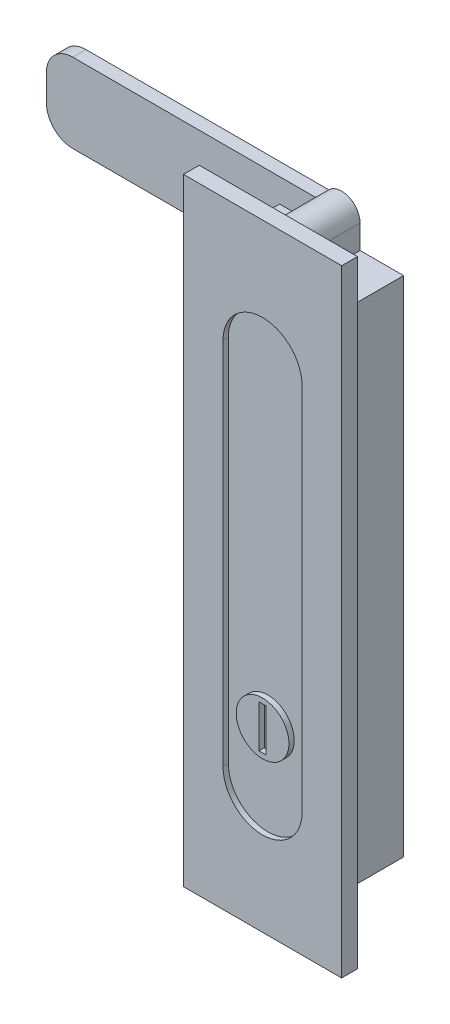
ISO-10303-21;
HEADER;
FILE_DESCRIPTION(('STEP AP214'),'2;1');
FILE_NAME('part.step','',(''),(''),'','','');
FILE_SCHEMA(('AUTOMOTIVE_DESIGN { 1 0 10303 214 1 1 1 1 }'));
ENDSEC;
DATA;
#1=APPLICATION_CONTEXT('core data for automotive mechanical design processes');
#2=APPLICATION_PROTOCOL_DEFINITION('international standard','automotive_design',2000,#1);
#3=PRODUCT_CONTEXT('',#1,'mechanical');
#4=PRODUCT('Part','Part','',(#3));
#5=PRODUCT_RELATED_PRODUCT_CATEGORY('part','',(#4));
#6=PRODUCT_DEFINITION_FORMATION('','',#4);
#7=PRODUCT_DEFINITION_CONTEXT('part definition',#1,'design');
#8=PRODUCT_DEFINITION('design','',#6,#7);
#9=PRODUCT_DEFINITION_SHAPE('','',#8);
#10=(LENGTH_UNIT() NAMED_UNIT(*) SI_UNIT(.MILLI.,.METRE.));
#11=(NAMED_UNIT(*) PLANE_ANGLE_UNIT() SI_UNIT($,.RADIAN.));
#12=(NAMED_UNIT(*) SI_UNIT($,.STERADIAN.) SOLID_ANGLE_UNIT());
#13=UNCERTAINTY_MEASURE_WITH_UNIT(LENGTH_MEASURE(1.E-05),#10,'distance_accuracy_value','');
#14=(GEOMETRIC_REPRESENTATION_CONTEXT(3) GLOBAL_UNCERTAINTY_ASSIGNED_CONTEXT((#13)) GLOBAL_UNIT_ASSIGNED_CONTEXT((#10,
#11,#12)) REPRESENTATION_CONTEXT('',''));
#15=CARTESIAN_POINT('',(0.,0.,0.));
#16=DIRECTION('',(0.,0.,1.));
#17=DIRECTION('',(1.,0.,0.));
#18=AXIS2_PLACEMENT_3D('',#15,#16,#17);
#19=CARTESIAN_POINT('',(15.,-58.5,3.));
#20=DIRECTION('',(-1.,0.,0.));
#21=DIRECTION('',(0.,0.,1.));
#22=AXIS2_PLACEMENT_3D('',#19,#20,#21);
#23=PLANE('',#22);
#24=DIRECTION('',(0.,1.,0.));
#25=VECTOR('',#24,1.);
#26=CARTESIAN_POINT('',(15.,-58.5,0.));
#27=LINE('',#26,#25);
#28=CARTESIAN_POINT('',(15.,-58.5,0.));
#29=VERTEX_POINT('',#28);
#30=CARTESIAN_POINT('',(15.,58.5,0.));
#31=VERTEX_POINT('',#30);
#32=EDGE_CURVE('E484',#29,#31,#27,.T.);
#33=ORIENTED_EDGE('',*,*,#32,.T.);
#34=DIRECTION('',(0.,0.,-1.));
#35=VECTOR('',#34,1.);
#36=CARTESIAN_POINT('',(15.,58.5,3.));
#37=LINE('',#36,#35);
#38=CARTESIAN_POINT('',(15.,58.5,3.));
#39=VERTEX_POINT('',#38);
#40=EDGE_CURVE('E44',#39,#31,#37,.T.);
#41=ORIENTED_EDGE('',*,*,#40,.F.);
#42=DIRECTION('',(0.,1.,0.));
#43=VECTOR('',#42,1.);
#44=CARTESIAN_POINT('',(15.,-58.5,3.));
#45=LINE('',#44,#43);
#46=CARTESIAN_POINT('',(15.,-58.5,3.));
#47=VERTEX_POINT('',#46);
#48=EDGE_CURVE('E494',#47,#39,#45,.T.);
#49=ORIENTED_EDGE('',*,*,#48,.F.);
#50=DIRECTION('',(0.,0.,-1.));
#51=VECTOR('',#50,1.);
#52=CARTESIAN_POINT('',(15.,-58.5,3.));
#53=LINE('',#52,#51);
#54=EDGE_CURVE('E508',#47,#29,#53,.T.);
#55=ORIENTED_EDGE('',*,*,#54,.T.);
#56=EDGE_LOOP('',(#33,#41,#49,#55));
#57=FACE_BOUND('',#56,.T.);
#58=ADVANCED_FACE('F41',(#57),#23,.F.);
#59=CARTESIAN_POINT('',(-15.,58.5,3.));
#60=DIRECTION('',(0.,-1.,0.));
#61=DIRECTION('',(0.,0.,-1.));
#62=AXIS2_PLACEMENT_3D('',#59,#60,#61);
#63=PLANE('',#62);
#64=DIRECTION('',(-1.,0.,0.));
#65=VECTOR('',#64,1.);
#66=CARTESIAN_POINT('',(-15.,58.5,0.));
#67=LINE('',#66,#65);
#68=CARTESIAN_POINT('',(-15.,58.5,0.));
#69=VERTEX_POINT('',#68);
#70=EDGE_CURVE('E512',#31,#69,#67,.T.);
#71=ORIENTED_EDGE('',*,*,#70,.T.);
#72=DIRECTION('',(0.,0.,-1.));
#73=VECTOR('',#72,1.);
#74=CARTESIAN_POINT('',(-15.,58.5,3.));
#75=LINE('',#74,#73);
#76=CARTESIAN_POINT('',(-15.,58.5,3.));
#77=VERTEX_POINT('',#76);
#78=EDGE_CURVE('E526',#77,#69,#75,.T.);
#79=ORIENTED_EDGE('',*,*,#78,.F.);
#80=DIRECTION('',(-1.,0.,0.));
#81=VECTOR('',#80,1.);
#82=CARTESIAN_POINT('',(-15.,58.5,3.));
#83=LINE('',#82,#81);
#84=EDGE_CURVE('E498',#39,#77,#83,.T.);
#85=ORIENTED_EDGE('',*,*,#84,.F.);
#86=ORIENTED_EDGE('',*,*,#40,.T.);
#87=EDGE_LOOP('',(#71,#79,#85,#86));
#88=FACE_BOUND('',#87,.T.);
#89=ADVANCED_FACE('F537',(#88),#63,.F.);
#90=CARTESIAN_POINT('',(-15.,-58.5,3.));
#91=DIRECTION('',(1.,0.,0.));
#92=DIRECTION('',(0.,0.,-1.));
#93=AXIS2_PLACEMENT_3D('',#90,#91,#92);
#94=PLANE('',#93);
#95=DIRECTION('',(0.,-1.,0.));
#96=VECTOR('',#95,1.);
#97=CARTESIAN_POINT('',(-15.,-58.5,0.));
#98=LINE('',#97,#96);
#99=CARTESIAN_POINT('',(-15.,-58.5,0.));
#100=VERTEX_POINT('',#99);
#101=EDGE_CURVE('E515',#69,#100,#98,.T.);
#102=ORIENTED_EDGE('',*,*,#101,.T.);
#103=DIRECTION('',(0.,0.,-1.));
#104=VECTOR('',#103,1.);
#105=CARTESIAN_POINT('',(-15.,-58.5,3.));
#106=LINE('',#105,#104);
#107=CARTESIAN_POINT('',(-15.,-58.5,3.));
#108=VERTEX_POINT('',#107);
#109=EDGE_CURVE('E523',#108,#100,#106,.T.);
#110=ORIENTED_EDGE('',*,*,#109,.F.);
#111=DIRECTION('',(0.,-1.,0.));
#112=VECTOR('',#111,1.);
#113=CARTESIAN_POINT('',(-15.,-58.5,3.));
#114=LINE('',#113,#112);
#115=EDGE_CURVE('E502',#77,#108,#114,.T.);
#116=ORIENTED_EDGE('',*,*,#115,.F.);
#117=ORIENTED_EDGE('',*,*,#78,.T.);
#118=EDGE_LOOP('',(#102,#110,#116,#117));
#119=FACE_BOUND('',#118,.T.);
#120=ADVANCED_FACE('F546',(#119),#94,.F.);
#121=CARTESIAN_POINT('',(-15.,-58.5,3.));
#122=DIRECTION('',(0.,1.,0.));
#123=DIRECTION('',(0.,0.,1.));
#124=AXIS2_PLACEMENT_3D('',#121,#122,#123);
#125=PLANE('',#124);
#126=DIRECTION('',(1.,0.,0.));
#127=VECTOR('',#126,1.);
#128=CARTESIAN_POINT('',(-15.,-58.5,0.));
#129=LINE('',#128,#127);
#130=EDGE_CURVE('E499',#100,#29,#129,.T.);
#131=ORIENTED_EDGE('',*,*,#130,.T.);
#132=ORIENTED_EDGE('',*,*,#54,.F.);
#133=DIRECTION('',(1.,0.,0.));
#134=VECTOR('',#133,1.);
#135=CARTESIAN_POINT('',(-15.,-58.5,3.));
#136=LINE('',#135,#134);
#137=EDGE_CURVE('E505',#108,#47,#136,.T.);
#138=ORIENTED_EDGE('',*,*,#137,.F.);
#139=ORIENTED_EDGE('',*,*,#109,.T.);
#140=EDGE_LOOP('',(#131,#132,#138,#139));
#141=FACE_BOUND('',#140,.T.);
#142=ADVANCED_FACE('F549',(#141),#125,.F.);
#143=CARTESIAN_POINT('',(0.,0.,3.));
#144=DIRECTION('',(0.,0.,-1.));
#145=DIRECTION('',(-1.,0.,0.));
#146=AXIS2_PLACEMENT_3D('',#143,#144,#145);
#147=PLANE('',#146);
#148=DIRECTION('',(0.,1.,0.));
#149=VECTOR('',#148,1.);
#150=CARTESIAN_POINT('',(7.5,-35.,3.));
#151=LINE('',#150,#149);
#152=CARTESIAN_POINT('',(7.5,-35.,3.));
#153=VERTEX_POINT('',#152);
#154=CARTESIAN_POINT('',(7.49999999999999,35.,3.));
#155=VERTEX_POINT('',#154);
#156=EDGE_CURVE('E470',#153,#155,#151,.T.);
#157=ORIENTED_EDGE('',*,*,#156,.F.);
#158=CARTESIAN_POINT('',(0.,-35.,3.));
#159=DIRECTION('',(0.,0.,1.));
#160=DIRECTION('',(1.,0.,0.));
#161=AXIS2_PLACEMENT_3D('',#158,#159,#160);
#162=CIRCLE('',#161,7.5);
#163=CARTESIAN_POINT('',(-7.5,-35.,3.));
#164=VERTEX_POINT('',#163);
#165=EDGE_CURVE('E446',#164,#153,#162,.T.);
#166=ORIENTED_EDGE('',*,*,#165,.F.);
#167=DIRECTION('',(0.,-1.,0.));
#168=VECTOR('',#167,1.);
#169=CARTESIAN_POINT('',(-7.5,-35.,3.));
#170=LINE('',#169,#168);
#171=CARTESIAN_POINT('',(-7.50000000000001,35.,3.));
#172=VERTEX_POINT('',#171);
#173=EDGE_CURVE('E455',#172,#164,#170,.T.);
#174=ORIENTED_EDGE('',*,*,#173,.F.);
#175=CARTESIAN_POINT('',(0.,35.,3.));
#176=DIRECTION('',(0.,0.,1.));
#177=DIRECTION('',(1.,0.,0.));
#178=AXIS2_PLACEMENT_3D('',#175,#176,#177);
#179=CIRCLE('',#178,7.5);
#180=EDGE_CURVE('E474',#155,#172,#179,.T.);
#181=ORIENTED_EDGE('',*,*,#180,.F.);
#182=EDGE_LOOP('',(#157,#166,#174,#181));
#183=FACE_BOUND('',#182,.T.);
#184=ORIENTED_EDGE('',*,*,#48,.T.);
#185=ORIENTED_EDGE('',*,*,#84,.T.);
#186=ORIENTED_EDGE('',*,*,#115,.T.);
#187=ORIENTED_EDGE('',*,*,#137,.T.);
#188=EDGE_LOOP('',(#184,#185,#186,#187));
#189=FACE_BOUND('',#188,.T.);
#190=ADVANCED_FACE('F551',(#183,#189),#147,.F.);
#191=CARTESIAN_POINT('',(0.,0.,0.));
#192=DIRECTION('',(0.,0.,-1.));
#193=DIRECTION('',(-1.,0.,0.));
#194=AXIS2_PLACEMENT_3D('',#191,#192,#193);
#195=PLANE('',#194);
#196=DIRECTION('',(-1.,0.,0.));
#197=VECTOR('',#196,1.);
#198=CARTESIAN_POINT('',(0.,-47.75,0.));
#199=LINE('',#198,#197);
#200=CARTESIAN_POINT('',(11.75,-47.75,0.));
#201=VERTEX_POINT('',#200);
#202=CARTESIAN_POINT('',(3.49999999999999,-47.75,0.));
#203=VERTEX_POINT('',#202);
#204=EDGE_CURVE('E264',#201,#203,#199,.T.);
#205=ORIENTED_EDGE('',*,*,#204,.F.);
#206=DIRECTION('',(0.,1.,0.));
#207=VECTOR('',#206,1.);
#208=CARTESIAN_POINT('',(11.75,0.,0.));
#209=LINE('',#208,#207);
#210=CARTESIAN_POINT('',(11.75,47.75,0.));
#211=VERTEX_POINT('',#210);
#212=EDGE_CURVE('E278',#201,#211,#209,.T.);
#213=ORIENTED_EDGE('',*,*,#212,.T.);
#214=DIRECTION('',(-1.,0.,0.));
#215=VECTOR('',#214,1.);
#216=CARTESIAN_POINT('',(0.,47.75,0.));
#217=LINE('',#216,#215);
#218=CARTESIAN_POINT('',(3.49999999999999,47.75,0.));
#219=VERTEX_POINT('',#218);
#220=EDGE_CURVE('E350',#211,#219,#217,.T.);
#221=ORIENTED_EDGE('',*,*,#220,.T.);
#222=DIRECTION('',(0.,1.,0.));
#223=VECTOR('',#222,1.);
#224=CARTESIAN_POINT('',(3.49999999999999,0.,0.));
#225=LINE('',#224,#223);
#226=CARTESIAN_POINT('',(3.5,52.25,0.));
#227=VERTEX_POINT('',#226);
#228=EDGE_CURVE('E346',#219,#227,#225,.T.);
#229=ORIENTED_EDGE('',*,*,#228,.T.);
#230=CARTESIAN_POINT('',(0.,52.25,0.));
#231=DIRECTION('',(0.,0.,-1.));
#232=DIRECTION('',(-1.,0.,0.));
#233=AXIS2_PLACEMENT_3D('',#230,#231,#232);
#234=CIRCLE('',#233,3.5);
#235=CARTESIAN_POINT('',(-3.49999999999999,52.25,0.));
#236=VERTEX_POINT('',#235);
#237=EDGE_CURVE('E342',#236,#227,#234,.T.);
#238=ORIENTED_EDGE('',*,*,#237,.F.);
#239=DIRECTION('',(0.,1.,0.));
#240=VECTOR('',#239,1.);
#241=CARTESIAN_POINT('',(-3.5,0.,0.));
#242=LINE('',#241,#240);
#243=CARTESIAN_POINT('',(-3.5,47.75,0.));
#244=VERTEX_POINT('',#243);
#245=EDGE_CURVE('E339',#244,#236,#242,.T.);
#246=ORIENTED_EDGE('',*,*,#245,.F.);
#247=DIRECTION('',(-1.,0.,0.));
#248=VECTOR('',#247,1.);
#249=CARTESIAN_POINT('',(0.,47.75,0.));
#250=LINE('',#249,#248);
#251=CARTESIAN_POINT('',(-11.75,47.75,0.));
#252=VERTEX_POINT('',#251);
#253=EDGE_CURVE('E335',#244,#252,#250,.T.);
#254=ORIENTED_EDGE('',*,*,#253,.T.);
#255=DIRECTION('',(0.,1.,0.));
#256=VECTOR('',#255,1.);
#257=CARTESIAN_POINT('',(-11.75,0.,0.));
#258=LINE('',#257,#256);
#259=CARTESIAN_POINT('',(-11.75,-47.75,0.));
#260=VERTEX_POINT('',#259);
#261=EDGE_CURVE('E331',#260,#252,#258,.T.);
#262=ORIENTED_EDGE('',*,*,#261,.F.);
#263=DIRECTION('',(-1.,0.,0.));
#264=VECTOR('',#263,1.);
#265=CARTESIAN_POINT('',(0.,-47.75,0.));
#266=LINE('',#265,#264);
#267=CARTESIAN_POINT('',(-3.5,-47.75,0.));
#268=VERTEX_POINT('',#267);
#269=EDGE_CURVE('E328',#268,#260,#266,.T.);
#270=ORIENTED_EDGE('',*,*,#269,.F.);
#271=DIRECTION('',(0.,1.,0.));
#272=VECTOR('',#271,1.);
#273=CARTESIAN_POINT('',(-3.5,0.,0.));
#274=LINE('',#273,#272);
#275=CARTESIAN_POINT('',(-3.50000000000001,-52.25,0.));
#276=VERTEX_POINT('',#275);
#277=EDGE_CURVE('E325',#276,#268,#274,.T.);
#278=ORIENTED_EDGE('',*,*,#277,.F.);
#279=CARTESIAN_POINT('',(0.,-52.25,0.));
#280=DIRECTION('',(0.,0.,-1.));
#281=DIRECTION('',(-1.,0.,0.));
#282=AXIS2_PLACEMENT_3D('',#279,#280,#281);
#283=CIRCLE('',#282,3.5);
#284=CARTESIAN_POINT('',(3.49999999999999,-52.25,0.));
#285=VERTEX_POINT('',#284);
#286=EDGE_CURVE('E322',#285,#276,#283,.T.);
#287=ORIENTED_EDGE('',*,*,#286,.F.);
#288=DIRECTION('',(0.,1.,0.));
#289=VECTOR('',#288,1.);
#290=CARTESIAN_POINT('',(3.49999999999999,0.,0.));
#291=LINE('',#290,#289);
#292=EDGE_CURVE('E268',#285,#203,#291,.T.);
#293=ORIENTED_EDGE('',*,*,#292,.T.);
#294=EDGE_LOOP('',(#205,#213,#221,#229,#238,#246,#254,#262,#270,#278,#287,#293));
#295=FACE_BOUND('',#294,.T.);
#296=ORIENTED_EDGE('',*,*,#32,.F.);
#297=ORIENTED_EDGE('',*,*,#130,.F.);
#298=ORIENTED_EDGE('',*,*,#101,.F.);
#299=ORIENTED_EDGE('',*,*,#70,.F.);
#300=EDGE_LOOP('',(#296,#297,#298,#299));
#301=FACE_BOUND('',#300,.T.);
#302=ADVANCED_FACE('F544',(#295,#301),#195,.T.);
#303=CARTESIAN_POINT('',(0.,-35.,2.));
#304=DIRECTION('',(0.,0.,1.));
#305=DIRECTION('',(1.,0.,0.));
#306=AXIS2_PLACEMENT_3D('',#303,#304,#305);
#307=CYLINDRICAL_SURFACE('',#306,7.5);
#308=ORIENTED_EDGE('',*,*,#165,.T.);
#309=DIRECTION('',(0.,0.,1.));
#310=VECTOR('',#309,1.);
#311=CARTESIAN_POINT('',(7.5,-35.,2.));
#312=LINE('',#311,#310);
#313=CARTESIAN_POINT('',(7.5,-35.,2.));
#314=VERTEX_POINT('',#313);
#315=EDGE_CURVE('E467',#314,#153,#312,.T.);
#316=ORIENTED_EDGE('',*,*,#315,.F.);
#317=CARTESIAN_POINT('',(0.,-35.,2.));
#318=DIRECTION('',(0.,0.,1.));
#319=DIRECTION('',(1.,0.,0.));
#320=AXIS2_PLACEMENT_3D('',#317,#318,#319);
#321=CIRCLE('',#320,7.5);
#322=CARTESIAN_POINT('',(-7.5,-35.,2.));
#323=VERTEX_POINT('',#322);
#324=EDGE_CURVE('E450',#323,#314,#321,.T.);
#325=ORIENTED_EDGE('',*,*,#324,.F.);
#326=DIRECTION('',(0.,0.,1.));
#327=VECTOR('',#326,1.);
#328=CARTESIAN_POINT('',(-7.5,-35.,2.));
#329=LINE('',#328,#327);
#330=EDGE_CURVE('E481',#323,#164,#329,.T.);
#331=ORIENTED_EDGE('',*,*,#330,.T.);
#332=EDGE_LOOP('',(#308,#316,#325,#331));
#333=FACE_BOUND('',#332,.T.);
#334=ADVANCED_FACE('F560',(#333),#307,.F.);
#335=CARTESIAN_POINT('',(-7.5,-35.,2.));
#336=DIRECTION('',(-1.,0.,0.));
#337=DIRECTION('',(0.,-1.,0.));
#338=AXIS2_PLACEMENT_3D('',#335,#336,#337);
#339=PLANE('',#338);
#340=ORIENTED_EDGE('',*,*,#173,.T.);
#341=ORIENTED_EDGE('',*,*,#330,.F.);
#342=DIRECTION('',(0.,-1.,0.));
#343=VECTOR('',#342,1.);
#344=CARTESIAN_POINT('',(-7.5,-35.,2.));
#345=LINE('',#344,#343);
#346=CARTESIAN_POINT('',(-7.50000000000001,35.,2.));
#347=VERTEX_POINT('',#346);
#348=EDGE_CURVE('E463',#347,#323,#345,.T.);
#349=ORIENTED_EDGE('',*,*,#348,.F.);
#350=DIRECTION('',(0.,0.,1.));
#351=VECTOR('',#350,1.);
#352=CARTESIAN_POINT('',(-7.50000000000001,35.,2.));
#353=LINE('',#352,#351);
#354=EDGE_CURVE('E485',#347,#172,#353,.T.);
#355=ORIENTED_EDGE('',*,*,#354,.T.);
#356=EDGE_LOOP('',(#340,#341,#349,#355));
#357=FACE_BOUND('',#356,.T.);
#358=ADVANCED_FACE('F598',(#357),#339,.F.);
#359=CARTESIAN_POINT('',(0.,35.,2.));
#360=DIRECTION('',(0.,0.,1.));
#361=DIRECTION('',(1.,0.,0.));
#362=AXIS2_PLACEMENT_3D('',#359,#360,#361);
#363=CYLINDRICAL_SURFACE('',#362,7.5);
#364=ORIENTED_EDGE('',*,*,#180,.T.);
#365=ORIENTED_EDGE('',*,*,#354,.F.);
#366=CARTESIAN_POINT('',(0.,35.,2.));
#367=DIRECTION('',(0.,0.,1.));
#368=DIRECTION('',(1.,0.,0.));
#369=AXIS2_PLACEMENT_3D('',#366,#367,#368);
#370=CIRCLE('',#369,7.5);
#371=CARTESIAN_POINT('',(7.49999999999999,35.,2.));
#372=VERTEX_POINT('',#371);
#373=EDGE_CURVE('E459',#372,#347,#370,.T.);
#374=ORIENTED_EDGE('',*,*,#373,.F.);
#375=DIRECTION('',(0.,0.,1.));
#376=VECTOR('',#375,1.);
#377=CARTESIAN_POINT('',(7.49999999999999,35.,2.));
#378=LINE('',#377,#376);
#379=EDGE_CURVE('E488',#372,#155,#378,.T.);
#380=ORIENTED_EDGE('',*,*,#379,.T.);
#381=EDGE_LOOP('',(#364,#365,#374,#380));
#382=FACE_BOUND('',#381,.T.);
#383=ADVANCED_FACE('F608',(#382),#363,.F.);
#384=CARTESIAN_POINT('',(7.5,-35.,2.));
#385=DIRECTION('',(1.,0.,0.));
#386=DIRECTION('',(0.,1.,0.));
#387=AXIS2_PLACEMENT_3D('',#384,#385,#386);
#388=PLANE('',#387);
#389=ORIENTED_EDGE('',*,*,#156,.T.);
#390=ORIENTED_EDGE('',*,*,#379,.F.);
#391=DIRECTION('',(0.,1.,0.));
#392=VECTOR('',#391,1.);
#393=CARTESIAN_POINT('',(7.5,-35.,2.));
#394=LINE('',#393,#392);
#395=EDGE_CURVE('E454',#314,#372,#394,.T.);
#396=ORIENTED_EDGE('',*,*,#395,.F.);
#397=ORIENTED_EDGE('',*,*,#315,.T.);
#398=EDGE_LOOP('',(#389,#390,#396,#397));
#399=FACE_BOUND('',#398,.T.);
#400=ADVANCED_FACE('F618',(#399),#388,.F.);
#401=CARTESIAN_POINT('',(0.,-35.,2.));
#402=DIRECTION('',(0.,0.,1.));
#403=DIRECTION('',(1.,0.,0.));
#404=AXIS2_PLACEMENT_3D('',#401,#402,#403);
#405=PLANE('',#404);
#406=CARTESIAN_POINT('',(0.,-25.,2.));
#407=DIRECTION('',(0.,0.,1.));
#408=DIRECTION('',(1.,0.,0.));
#409=AXIS2_PLACEMENT_3D('',#406,#407,#408);
#410=CIRCLE('',#409,5.);
#411=CARTESIAN_POINT('',(5.,-25.,2.));
#412=VERTEX_POINT('',#411);
#413=EDGE_CURVE('E442',#412,#412,#410,.T.);
#414=ORIENTED_EDGE('',*,*,#413,.F.);
#415=EDGE_LOOP('',(#414));
#416=FACE_BOUND('',#415,.T.);
#417=ORIENTED_EDGE('',*,*,#324,.T.);
#418=ORIENTED_EDGE('',*,*,#395,.T.);
#419=ORIENTED_EDGE('',*,*,#373,.T.);
#420=ORIENTED_EDGE('',*,*,#348,.T.);
#421=EDGE_LOOP('',(#417,#418,#419,#420));
#422=FACE_BOUND('',#421,.T.);
#423=ADVANCED_FACE('F628',(#416,#422),#405,.T.);
#424=CARTESIAN_POINT('',(0.,-25.,2.));
#425=DIRECTION('',(0.,0.,1.));
#426=DIRECTION('',(1.,0.,0.));
#427=AXIS2_PLACEMENT_3D('',#424,#425,#426);
#428=CYLINDRICAL_SURFACE('',#427,5.);
#429=ORIENTED_EDGE('',*,*,#413,.T.);
#430=EDGE_LOOP('',(#429));
#431=FACE_BOUND('',#430,.T.);
#432=CARTESIAN_POINT('',(0.,-25.,3.));
#433=DIRECTION('',(0.,0.,1.));
#434=DIRECTION('',(1.,0.,0.));
#435=AXIS2_PLACEMENT_3D('',#432,#433,#434);
#436=CIRCLE('',#435,5.);
#437=CARTESIAN_POINT('',(5.,-25.,3.));
#438=VERTEX_POINT('',#437);
#439=EDGE_CURVE('E432',#438,#438,#436,.T.);
#440=ORIENTED_EDGE('',*,*,#439,.F.);
#441=EDGE_LOOP('',(#440));
#442=FACE_BOUND('',#441,.T.);
#443=ADVANCED_FACE('F568',(#431,#442),#428,.T.);
#444=DIRECTION('',(-1.,0.,0.));
#445=VECTOR('',#444,1.);
#446=CARTESIAN_POINT('',(-0.675723307919637,-20.9707927175478,3.));
#447=LINE('',#446,#445);
#448=CARTESIAN_POINT('',(0.675723307919637,-20.9707927175478,3.));
#449=VERTEX_POINT('',#448);
#450=CARTESIAN_POINT('',(-0.675723307919637,-20.9707927175478,3.));
#451=VERTEX_POINT('',#450);
#452=EDGE_CURVE('E418',#449,#451,#447,.T.);
#453=ORIENTED_EDGE('',*,*,#452,.F.);
#454=DIRECTION('',(0.,1.,0.));
#455=VECTOR('',#454,1.);
#456=CARTESIAN_POINT('',(0.675723307919637,-29.0292072824523,3.));
#457=LINE('',#456,#455);
#458=CARTESIAN_POINT('',(0.675723307919637,-29.0292072824523,3.));
#459=VERTEX_POINT('',#458);
#460=EDGE_CURVE('E397',#459,#449,#457,.T.);
#461=ORIENTED_EDGE('',*,*,#460,.F.);
#462=DIRECTION('',(1.,0.,0.));
#463=VECTOR('',#462,1.);
#464=CARTESIAN_POINT('',(-0.675723307919637,-29.0292072824523,3.));
#465=LINE('',#464,#463);
#466=CARTESIAN_POINT('',(-0.675723307919637,-29.0292072824523,3.));
#467=VERTEX_POINT('',#466);
#468=EDGE_CURVE('E403',#467,#459,#465,.T.);
#469=ORIENTED_EDGE('',*,*,#468,.F.);
#470=DIRECTION('',(0.,-1.,0.));
#471=VECTOR('',#470,1.);
#472=CARTESIAN_POINT('',(-0.675723307919637,-29.0292072824523,3.));
#473=LINE('',#472,#471);
#474=EDGE_CURVE('E422',#451,#467,#473,.T.);
#475=ORIENTED_EDGE('',*,*,#474,.F.);
#476=EDGE_LOOP('',(#453,#461,#469,#475));
#477=FACE_BOUND('',#476,.T.);
#478=ORIENTED_EDGE('',*,*,#439,.T.);
#479=EDGE_LOOP('',(#478));
#480=FACE_BOUND('',#479,.T.);
#481=ADVANCED_FACE('F555',(#477,#480),#147,.F.);
#482=CARTESIAN_POINT('',(0.675723307919637,-29.0292072824523,2.));
#483=DIRECTION('',(1.,0.,0.));
#484=DIRECTION('',(0.,0.,-1.));
#485=AXIS2_PLACEMENT_3D('',#482,#483,#484);
#486=PLANE('',#485);
#487=ORIENTED_EDGE('',*,*,#460,.T.);
#488=DIRECTION('',(0.,0.,1.));
#489=VECTOR('',#488,1.);
#490=CARTESIAN_POINT('',(0.675723307919637,-20.9707927175478,2.));
#491=LINE('',#490,#489);
#492=CARTESIAN_POINT('',(0.675723307919637,-20.9707927175478,2.));
#493=VERTEX_POINT('',#492);
#494=EDGE_CURVE('E415',#493,#449,#491,.T.);
#495=ORIENTED_EDGE('',*,*,#494,.F.);
#496=DIRECTION('',(0.,1.,0.));
#497=VECTOR('',#496,1.);
#498=CARTESIAN_POINT('',(0.675723307919637,-29.0292072824523,2.));
#499=LINE('',#498,#497);
#500=CARTESIAN_POINT('',(0.675723307919637,-29.0292072824523,2.));
#501=VERTEX_POINT('',#500);
#502=EDGE_CURVE('E398',#501,#493,#499,.T.);
#503=ORIENTED_EDGE('',*,*,#502,.F.);
#504=DIRECTION('',(0.,0.,1.));
#505=VECTOR('',#504,1.);
#506=CARTESIAN_POINT('',(0.675723307919637,-29.0292072824523,2.));
#507=LINE('',#506,#505);
#508=EDGE_CURVE('E429',#501,#459,#507,.T.);
#509=ORIENTED_EDGE('',*,*,#508,.T.);
#510=EDGE_LOOP('',(#487,#495,#503,#509));
#511=FACE_BOUND('',#510,.T.);
#512=ADVANCED_FACE('F567',(#511),#486,.F.);
#513=CARTESIAN_POINT('',(-0.675723307919637,-29.0292072824523,2.));
#514=DIRECTION('',(0.,-1.,0.));
#515=DIRECTION('',(0.,0.,-1.));
#516=AXIS2_PLACEMENT_3D('',#513,#514,#515);
#517=PLANE('',#516);
#518=ORIENTED_EDGE('',*,*,#468,.T.);
#519=ORIENTED_EDGE('',*,*,#508,.F.);
#520=DIRECTION('',(1.,0.,0.));
#521=VECTOR('',#520,1.);
#522=CARTESIAN_POINT('',(-0.675723307919637,-29.0292072824523,2.));
#523=LINE('',#522,#521);
#524=CARTESIAN_POINT('',(-0.675723307919637,-29.0292072824523,2.));
#525=VERTEX_POINT('',#524);
#526=EDGE_CURVE('E411',#525,#501,#523,.T.);
#527=ORIENTED_EDGE('',*,*,#526,.F.);
#528=DIRECTION('',(0.,0.,1.));
#529=VECTOR('',#528,1.);
#530=CARTESIAN_POINT('',(-0.675723307919637,-29.0292072824523,2.));
#531=LINE('',#530,#529);
#532=EDGE_CURVE('E433',#525,#467,#531,.T.);
#533=ORIENTED_EDGE('',*,*,#532,.T.);
#534=EDGE_LOOP('',(#518,#519,#527,#533));
#535=FACE_BOUND('',#534,.T.);
#536=ADVANCED_FACE('F661',(#535),#517,.F.);
#537=CARTESIAN_POINT('',(-0.675723307919637,-29.0292072824523,2.));
#538=DIRECTION('',(-1.,0.,0.));
#539=DIRECTION('',(0.,0.,1.));
#540=AXIS2_PLACEMENT_3D('',#537,#538,#539);
#541=PLANE('',#540);
#542=ORIENTED_EDGE('',*,*,#474,.T.);
#543=ORIENTED_EDGE('',*,*,#532,.F.);
#544=DIRECTION('',(0.,-1.,0.));
#545=VECTOR('',#544,1.);
#546=CARTESIAN_POINT('',(-0.675723307919637,-29.0292072824523,2.));
#547=LINE('',#546,#545);
#548=CARTESIAN_POINT('',(-0.675723307919637,-20.9707927175478,2.));
#549=VERTEX_POINT('',#548);
#550=EDGE_CURVE('E407',#549,#525,#547,.T.);
#551=ORIENTED_EDGE('',*,*,#550,.F.);
#552=DIRECTION('',(0.,0.,1.));
#553=VECTOR('',#552,1.);
#554=CARTESIAN_POINT('',(-0.675723307919637,-20.9707927175478,2.));
#555=LINE('',#554,#553);
#556=EDGE_CURVE('E436',#549,#451,#555,.T.);
#557=ORIENTED_EDGE('',*,*,#556,.T.);
#558=EDGE_LOOP('',(#542,#543,#551,#557));
#559=FACE_BOUND('',#558,.T.);
#560=ADVANCED_FACE('F671',(#559),#541,.F.);
#561=CARTESIAN_POINT('',(-0.675723307919637,-20.9707927175478,2.));
#562=DIRECTION('',(0.,1.,0.));
#563=DIRECTION('',(0.,0.,1.));
#564=AXIS2_PLACEMENT_3D('',#561,#562,#563);
#565=PLANE('',#564);
#566=ORIENTED_EDGE('',*,*,#452,.T.);
#567=ORIENTED_EDGE('',*,*,#556,.F.);
#568=DIRECTION('',(-1.,0.,0.));
#569=VECTOR('',#568,1.);
#570=CARTESIAN_POINT('',(-0.675723307919637,-20.9707927175478,2.));
#571=LINE('',#570,#569);
#572=EDGE_CURVE('E402',#493,#549,#571,.T.);
#573=ORIENTED_EDGE('',*,*,#572,.F.);
#574=ORIENTED_EDGE('',*,*,#494,.T.);
#575=EDGE_LOOP('',(#566,#567,#573,#574));
#576=FACE_BOUND('',#575,.T.);
#577=ADVANCED_FACE('F681',(#576),#565,.F.);
#578=CARTESIAN_POINT('',(0.,0.,2.));
#579=DIRECTION('',(0.,0.,-1.));
#580=DIRECTION('',(-1.,0.,0.));
#581=AXIS2_PLACEMENT_3D('',#578,#579,#580);
#582=PLANE('',#581);
#583=ORIENTED_EDGE('',*,*,#502,.T.);
#584=ORIENTED_EDGE('',*,*,#572,.T.);
#585=ORIENTED_EDGE('',*,*,#550,.T.);
#586=ORIENTED_EDGE('',*,*,#526,.T.);
#587=EDGE_LOOP('',(#583,#584,#585,#586));
#588=FACE_BOUND('',#587,.T.);
#589=ADVANCED_FACE('F691',(#588),#582,.F.);
#590=CARTESIAN_POINT('',(0.,-47.75,-12.));
#591=DIRECTION('',(0.,1.,0.));
#592=DIRECTION('',(0.,0.,1.));
#593=AXIS2_PLACEMENT_3D('',#590,#591,#592);
#594=PLANE('',#593);
#595=ORIENTED_EDGE('',*,*,#204,.T.);
#596=DIRECTION('',(0.,0.,1.));
#597=VECTOR('',#596,1.);
#598=CARTESIAN_POINT('',(3.49999999999999,-47.75,-12.));
#599=LINE('',#598,#597);
#600=CARTESIAN_POINT('',(3.49999999999999,-47.75,-12.));
#601=VERTEX_POINT('',#600);
#602=EDGE_CURVE('E393',#601,#203,#599,.T.);
#603=ORIENTED_EDGE('',*,*,#602,.F.);
#604=DIRECTION('',(-1.,0.,0.));
#605=VECTOR('',#604,1.);
#606=CARTESIAN_POINT('',(0.,-47.75,-12.));
#607=LINE('',#606,#605);
#608=CARTESIAN_POINT('',(11.75,-47.75,-12.));
#609=VERTEX_POINT('',#608);
#610=EDGE_CURVE('E274',#609,#601,#607,.T.);
#611=ORIENTED_EDGE('',*,*,#610,.F.);
#612=DIRECTION('',(0.,0.,1.));
#613=VECTOR('',#612,1.);
#614=CARTESIAN_POINT('',(11.75,-47.75,-12.));
#615=LINE('',#614,#613);
#616=EDGE_CURVE('E317',#609,#201,#615,.T.);
#617=ORIENTED_EDGE('',*,*,#616,.T.);
#618=EDGE_LOOP('',(#595,#603,#611,#617));
#619=FACE_BOUND('',#618,.T.);
#620=ADVANCED_FACE('F701',(#619),#594,.F.);
#621=CARTESIAN_POINT('',(3.49999999999999,0.,-12.));
#622=DIRECTION('',(1.,0.,0.));
#623=DIRECTION('',(0.,1.,0.));
#624=AXIS2_PLACEMENT_3D('',#621,#622,#623);
#625=PLANE('',#624);
#626=ORIENTED_EDGE('',*,*,#292,.F.);
#627=DIRECTION('',(0.,0.,1.));
#628=VECTOR('',#627,1.);
#629=CARTESIAN_POINT('',(3.49999999999999,-52.25,-12.));
#630=LINE('',#629,#628);
#631=CARTESIAN_POINT('',(3.49999999999999,-52.25,-12.));
#632=VERTEX_POINT('',#631);
#633=EDGE_CURVE('E390',#632,#285,#630,.T.);
#634=ORIENTED_EDGE('',*,*,#633,.F.);
#635=DIRECTION('',(0.,1.,0.));
#636=VECTOR('',#635,1.);
#637=CARTESIAN_POINT('',(3.49999999999999,0.,-12.));
#638=LINE('',#637,#636);
#639=EDGE_CURVE('E277',#632,#601,#638,.T.);
#640=ORIENTED_EDGE('',*,*,#639,.T.);
#641=ORIENTED_EDGE('',*,*,#602,.T.);
#642=EDGE_LOOP('',(#626,#634,#640,#641));
#643=FACE_BOUND('',#642,.T.);
#644=ADVANCED_FACE('F716',(#643),#625,.T.);
#645=CARTESIAN_POINT('',(0.,-52.25,-12.));
#646=DIRECTION('',(0.,0.,1.));
#647=DIRECTION('',(1.,0.,0.));
#648=AXIS2_PLACEMENT_3D('',#645,#646,#647);
#649=CYLINDRICAL_SURFACE('',#648,3.5);
#650=ORIENTED_EDGE('',*,*,#286,.T.);
#651=DIRECTION('',(0.,0.,1.));
#652=VECTOR('',#651,1.);
#653=CARTESIAN_POINT('',(-3.50000000000001,-52.25,-12.));
#654=LINE('',#653,#652);
#655=CARTESIAN_POINT('',(-3.50000000000001,-52.25,-12.));
#656=VERTEX_POINT('',#655);
#657=EDGE_CURVE('E386',#656,#276,#654,.T.);
#658=ORIENTED_EDGE('',*,*,#657,.F.);
#659=CARTESIAN_POINT('',(0.,-52.25,-12.));
#660=DIRECTION('',(0.,0.,-1.));
#661=DIRECTION('',(-1.,0.,0.));
#662=AXIS2_PLACEMENT_3D('',#659,#660,#661);
#663=CIRCLE('',#662,3.5);
#664=EDGE_CURVE('E282',#632,#656,#663,.T.);
#665=ORIENTED_EDGE('',*,*,#664,.F.);
#666=ORIENTED_EDGE('',*,*,#633,.T.);
#667=EDGE_LOOP('',(#650,#658,#665,#666));
#668=FACE_BOUND('',#667,.T.);
#669=ADVANCED_FACE('F726',(#668),#649,.T.);
#670=CARTESIAN_POINT('',(-3.5,0.,-12.));
#671=DIRECTION('',(1.,0.,0.));
#672=DIRECTION('',(0.,1.,0.));
#673=AXIS2_PLACEMENT_3D('',#670,#671,#672);
#674=PLANE('',#673);
#675=ORIENTED_EDGE('',*,*,#277,.T.);
#676=DIRECTION('',(0.,0.,1.));
#677=VECTOR('',#676,1.);
#678=CARTESIAN_POINT('',(-3.5,-47.75,-12.));
#679=LINE('',#678,#677);
#680=CARTESIAN_POINT('',(-3.5,-47.75,-12.));
#681=VERTEX_POINT('',#680);
#682=EDGE_CURVE('E382',#681,#268,#679,.T.);
#683=ORIENTED_EDGE('',*,*,#682,.F.);
#684=DIRECTION('',(0.,1.,0.));
#685=VECTOR('',#684,1.);
#686=CARTESIAN_POINT('',(-3.5,0.,-12.));
#687=LINE('',#686,#685);
#688=EDGE_CURVE('E285',#656,#681,#687,.T.);
#689=ORIENTED_EDGE('',*,*,#688,.F.);
#690=ORIENTED_EDGE('',*,*,#657,.T.);
#691=EDGE_LOOP('',(#675,#683,#689,#690));
#692=FACE_BOUND('',#691,.T.);
#693=ADVANCED_FACE('F736',(#692),#674,.F.);
#694=CARTESIAN_POINT('',(0.,-47.75,-12.));
#695=DIRECTION('',(0.,1.,0.));
#696=DIRECTION('',(0.,0.,1.));
#697=AXIS2_PLACEMENT_3D('',#694,#695,#696);
#698=PLANE('',#697);
#699=ORIENTED_EDGE('',*,*,#269,.T.);
#700=DIRECTION('',(0.,0.,1.));
#701=VECTOR('',#700,1.);
#702=CARTESIAN_POINT('',(-11.75,-47.75,-12.));
#703=LINE('',#702,#701);
#704=CARTESIAN_POINT('',(-11.75,-47.75,-12.));
#705=VERTEX_POINT('',#704);
#706=EDGE_CURVE('E378',#705,#260,#703,.T.);
#707=ORIENTED_EDGE('',*,*,#706,.F.);
#708=DIRECTION('',(-1.,0.,0.));
#709=VECTOR('',#708,1.);
#710=CARTESIAN_POINT('',(0.,-47.75,-12.));
#711=LINE('',#710,#709);
#712=EDGE_CURVE('E288',#681,#705,#711,.T.);
#713=ORIENTED_EDGE('',*,*,#712,.F.);
#714=ORIENTED_EDGE('',*,*,#682,.T.);
#715=EDGE_LOOP('',(#699,#707,#713,#714));
#716=FACE_BOUND('',#715,.T.);
#717=ADVANCED_FACE('F746',(#716),#698,.F.);
#718=CARTESIAN_POINT('',(-11.75,0.,-12.));
#719=DIRECTION('',(1.,0.,0.));
#720=DIRECTION('',(0.,1.,0.));
#721=AXIS2_PLACEMENT_3D('',#718,#719,#720);
#722=PLANE('',#721);
#723=ORIENTED_EDGE('',*,*,#261,.T.);
#724=DIRECTION('',(0.,0.,1.));
#725=VECTOR('',#724,1.);
#726=CARTESIAN_POINT('',(-11.75,47.75,-12.));
#727=LINE('',#726,#725);
#728=CARTESIAN_POINT('',(-11.75,47.75,-12.));
#729=VERTEX_POINT('',#728);
#730=EDGE_CURVE('E375',#729,#252,#727,.T.);
#731=ORIENTED_EDGE('',*,*,#730,.F.);
#732=DIRECTION('',(0.,1.,0.));
#733=VECTOR('',#732,1.);
#734=CARTESIAN_POINT('',(-11.75,0.,-12.));
#735=LINE('',#734,#733);
#736=CARTESIAN_POINT('',(-11.75,37.25,-12.));
#737=VERTEX_POINT('',#736);
#738=EDGE_CURVE('E291',#737,#729,#735,.T.);
#739=ORIENTED_EDGE('',*,*,#738,.F.);
#740=EDGE_CURVE('E292',#705,#737,#735,.T.);
#741=ORIENTED_EDGE('',*,*,#740,.F.);
#742=ORIENTED_EDGE('',*,*,#706,.T.);
#743=EDGE_LOOP('',(#723,#731,#739,#741,#742));
#744=FACE_BOUND('',#743,.T.);
#745=ADVANCED_FACE('F756',(#744),#722,.F.);
#746=CARTESIAN_POINT('',(0.,47.75,-12.));
#747=DIRECTION('',(0.,1.,0.));
#748=DIRECTION('',(0.,0.,1.));
#749=AXIS2_PLACEMENT_3D('',#746,#747,#748);
#750=PLANE('',#749);
#751=ORIENTED_EDGE('',*,*,#253,.F.);
#752=DIRECTION('',(0.,0.,1.));
#753=VECTOR('',#752,1.);
#754=CARTESIAN_POINT('',(-3.5,47.75,-12.));
#755=LINE('',#754,#753);
#756=CARTESIAN_POINT('',(-3.5,47.75,-12.));
#757=VERTEX_POINT('',#756);
#758=EDGE_CURVE('E372',#757,#244,#755,.T.);
#759=ORIENTED_EDGE('',*,*,#758,.F.);
#760=DIRECTION('',(-1.,0.,0.));
#761=VECTOR('',#760,1.);
#762=CARTESIAN_POINT('',(0.,47.75,-12.));
#763=LINE('',#762,#761);
#764=EDGE_CURVE('E295',#757,#729,#763,.T.);
#765=ORIENTED_EDGE('',*,*,#764,.T.);
#766=ORIENTED_EDGE('',*,*,#730,.T.);
#767=EDGE_LOOP('',(#751,#759,#765,#766));
#768=FACE_BOUND('',#767,.T.);
#769=ADVANCED_FACE('F802',(#768),#750,.T.);
#770=CARTESIAN_POINT('',(-3.5,0.,-12.));
#771=DIRECTION('',(1.,0.,0.));
#772=DIRECTION('',(0.,1.,0.));
#773=AXIS2_PLACEMENT_3D('',#770,#771,#772);
#774=PLANE('',#773);
#775=ORIENTED_EDGE('',*,*,#245,.T.);
#776=DIRECTION('',(0.,0.,1.));
#777=VECTOR('',#776,1.);
#778=CARTESIAN_POINT('',(-3.49999999999999,52.25,-12.));
#779=LINE('',#778,#777);
#780=CARTESIAN_POINT('',(-3.49999999999999,52.25,-12.));
#781=VERTEX_POINT('',#780);
#782=EDGE_CURVE('E368',#781,#236,#779,.T.);
#783=ORIENTED_EDGE('',*,*,#782,.F.);
#784=DIRECTION('',(0.,1.,0.));
#785=VECTOR('',#784,1.);
#786=CARTESIAN_POINT('',(-3.5,0.,-12.));
#787=LINE('',#786,#785);
#788=EDGE_CURVE('E299',#757,#781,#787,.T.);
#789=ORIENTED_EDGE('',*,*,#788,.F.);
#790=ORIENTED_EDGE('',*,*,#758,.T.);
#791=EDGE_LOOP('',(#775,#783,#789,#790));
#792=FACE_BOUND('',#791,.T.);
#793=ADVANCED_FACE('F812',(#792),#774,.F.);
#794=CARTESIAN_POINT('',(0.,52.25,-12.));
#795=DIRECTION('',(0.,0.,1.));
#796=DIRECTION('',(1.,0.,0.));
#797=AXIS2_PLACEMENT_3D('',#794,#795,#796);
#798=CYLINDRICAL_SURFACE('',#797,3.5);
#799=ORIENTED_EDGE('',*,*,#237,.T.);
#800=DIRECTION('',(0.,0.,1.));
#801=VECTOR('',#800,1.);
#802=CARTESIAN_POINT('',(3.5,52.25,-12.));
#803=LINE('',#802,#801);
#804=CARTESIAN_POINT('',(3.5,52.25,-12.));
#805=VERTEX_POINT('',#804);
#806=EDGE_CURVE('E365',#805,#227,#803,.T.);
#807=ORIENTED_EDGE('',*,*,#806,.F.);
#808=CARTESIAN_POINT('',(0.,52.25,-12.));
#809=DIRECTION('',(0.,0.,-1.));
#810=DIRECTION('',(-1.,0.,0.));
#811=AXIS2_PLACEMENT_3D('',#808,#809,#810);
#812=CIRCLE('',#811,3.5);
#813=EDGE_CURVE('E303',#781,#805,#812,.T.);
#814=ORIENTED_EDGE('',*,*,#813,.F.);
#815=ORIENTED_EDGE('',*,*,#782,.T.);
#816=EDGE_LOOP('',(#799,#807,#814,#815));
#817=FACE_BOUND('',#816,.T.);
#818=ADVANCED_FACE('F770',(#817),#798,.T.);
#819=CARTESIAN_POINT('',(3.49999999999999,0.,-12.));
#820=DIRECTION('',(1.,0.,0.));
#821=DIRECTION('',(0.,1.,0.));
#822=AXIS2_PLACEMENT_3D('',#819,#820,#821);
#823=PLANE('',#822);
#824=ORIENTED_EDGE('',*,*,#228,.F.);
#825=DIRECTION('',(0.,0.,1.));
#826=VECTOR('',#825,1.);
#827=CARTESIAN_POINT('',(3.49999999999999,47.75,-12.));
#828=LINE('',#827,#826);
#829=CARTESIAN_POINT('',(3.49999999999999,47.75,-12.));
#830=VERTEX_POINT('',#829);
#831=EDGE_CURVE('E362',#830,#219,#828,.T.);
#832=ORIENTED_EDGE('',*,*,#831,.F.);
#833=DIRECTION('',(0.,1.,0.));
#834=VECTOR('',#833,1.);
#835=CARTESIAN_POINT('',(3.49999999999999,0.,-12.));
#836=LINE('',#835,#834);
#837=EDGE_CURVE('E306',#830,#805,#836,.T.);
#838=ORIENTED_EDGE('',*,*,#837,.T.);
#839=ORIENTED_EDGE('',*,*,#806,.T.);
#840=EDGE_LOOP('',(#824,#832,#838,#839));
#841=FACE_BOUND('',#840,.T.);
#842=ADVANCED_FACE('F764',(#841),#823,.T.);
#843=CARTESIAN_POINT('',(0.,47.75,-12.));
#844=DIRECTION('',(0.,1.,0.));
#845=DIRECTION('',(0.,0.,1.));
#846=AXIS2_PLACEMENT_3D('',#843,#844,#845);
#847=PLANE('',#846);
#848=ORIENTED_EDGE('',*,*,#220,.F.);
#849=DIRECTION('',(0.,0.,1.));
#850=VECTOR('',#849,1.);
#851=CARTESIAN_POINT('',(11.75,47.75,-12.));
#852=LINE('',#851,#850);
#853=CARTESIAN_POINT('',(11.75,47.75,-12.));
#854=VERTEX_POINT('',#853);
#855=EDGE_CURVE('E359',#854,#211,#852,.T.);
#856=ORIENTED_EDGE('',*,*,#855,.F.);
#857=DIRECTION('',(-1.,0.,0.));
#858=VECTOR('',#857,1.);
#859=CARTESIAN_POINT('',(0.,47.75,-12.));
#860=LINE('',#859,#858);
#861=EDGE_CURVE('E310',#854,#830,#860,.T.);
#862=ORIENTED_EDGE('',*,*,#861,.T.);
#863=ORIENTED_EDGE('',*,*,#831,.T.);
#864=EDGE_LOOP('',(#848,#856,#862,#863));
#865=FACE_BOUND('',#864,.T.);
#866=ADVANCED_FACE('F769',(#865),#847,.T.);
#867=CARTESIAN_POINT('',(11.75,0.,-12.));
#868=DIRECTION('',(1.,0.,0.));
#869=DIRECTION('',(0.,0.,-1.));
#870=AXIS2_PLACEMENT_3D('',#867,#868,#869);
#871=PLANE('',#870);
#872=ORIENTED_EDGE('',*,*,#212,.F.);
#873=ORIENTED_EDGE('',*,*,#616,.F.);
#874=DIRECTION('',(0.,1.,0.));
#875=VECTOR('',#874,1.);
#876=CARTESIAN_POINT('',(11.75,0.,-12.));
#877=LINE('',#876,#875);
#878=EDGE_CURVE('E314',#609,#854,#877,.T.);
#879=ORIENTED_EDGE('',*,*,#878,.T.);
#880=ORIENTED_EDGE('',*,*,#855,.T.);
#881=EDGE_LOOP('',(#872,#873,#879,#880));
#882=FACE_BOUND('',#881,.T.);
#883=ADVANCED_FACE('F782',(#882),#871,.T.);
#884=CARTESIAN_POINT('',(0.,0.,-12.));
#885=DIRECTION('',(0.,0.,-1.));
#886=DIRECTION('',(-1.,0.,0.));
#887=AXIS2_PLACEMENT_3D('',#884,#885,#886);
#888=PLANE('',#887);
#889=DIRECTION('',(1.,0.,0.));
#890=VECTOR('',#889,1.);
#891=CARTESIAN_POINT('',(0.,52.25,-12.));
#892=LINE('',#891,#890);
#893=CARTESIAN_POINT('',(0.,52.25,-12.));
#894=VERTEX_POINT('',#893);
#895=EDGE_CURVE('E11',#781,#894,#892,.T.);
#896=ORIENTED_EDGE('',*,*,#895,.F.);
#897=ORIENTED_EDGE('',*,*,#813,.T.);
#898=ORIENTED_EDGE('',*,*,#837,.F.);
#899=ORIENTED_EDGE('',*,*,#861,.F.);
#900=ORIENTED_EDGE('',*,*,#878,.F.);
#901=ORIENTED_EDGE('',*,*,#610,.T.);
#902=ORIENTED_EDGE('',*,*,#639,.F.);
#903=ORIENTED_EDGE('',*,*,#664,.T.);
#904=ORIENTED_EDGE('',*,*,#688,.T.);
#905=ORIENTED_EDGE('',*,*,#712,.T.);
#906=ORIENTED_EDGE('',*,*,#740,.T.);
#907=DIRECTION('',(-1.,0.,0.));
#908=VECTOR('',#907,1.);
#909=CARTESIAN_POINT('',(-51.,37.25,-12.));
#910=LINE('',#909,#908);
#911=CARTESIAN_POINT('',(0.,37.25,-12.));
#912=VERTEX_POINT('',#911);
#913=EDGE_CURVE('E62',#912,#737,#910,.T.);
#914=ORIENTED_EDGE('',*,*,#913,.F.);
#915=DIRECTION('',(0.,-1.,0.));
#916=VECTOR('',#915,1.);
#917=CARTESIAN_POINT('',(0.,37.25,-12.));
#918=LINE('',#917,#916);
#919=EDGE_CURVE('E58',#894,#912,#918,.T.);
#920=ORIENTED_EDGE('',*,*,#919,.F.);
#921=EDGE_LOOP('',(#896,#897,#898,#899,#900,#901,#902,#903,#904,#905,#906,#914,#920));
#922=FACE_BOUND('',#921,.T.);
#923=ADVANCED_FACE('F792',(#922),#888,.T.);
#924=CARTESIAN_POINT('',(-51.,47.25,-12.));
#925=DIRECTION('',(0.,0.,-1.));
#926=DIRECTION('',(-1.,0.,0.));
#927=AXIS2_PLACEMENT_3D('',#924,#925,#926);
#928=PLANE('',#927);
#929=CARTESIAN_POINT('',(-50.9999999999999,37.25,-12.));
#930=VERTEX_POINT('',#929);
#931=EDGE_CURVE('E952',#737,#930,#910,.T.);
#932=ORIENTED_EDGE('',*,*,#931,.F.);
#933=ORIENTED_EDGE('',*,*,#738,.T.);
#934=ORIENTED_EDGE('',*,*,#764,.F.);
#935=ORIENTED_EDGE('',*,*,#788,.T.);
#936=CARTESIAN_POINT('',(-51.,52.25,-12.));
#937=VERTEX_POINT('',#936);
#938=EDGE_CURVE('E51',#937,#781,#892,.T.);
#939=ORIENTED_EDGE('',*,*,#938,.F.);
#940=CARTESIAN_POINT('',(-51.,47.25,-12.));
#941=DIRECTION('',(0.,0.,-1.));
#942=DIRECTION('',(-1.,0.,0.));
#943=AXIS2_PLACEMENT_3D('',#940,#941,#942);
#944=CIRCLE('',#943,5.);
#945=CARTESIAN_POINT('',(-56.,47.25,-12.));
#946=VERTEX_POINT('',#945);
#947=EDGE_CURVE('E922',#946,#937,#944,.T.);
#948=ORIENTED_EDGE('',*,*,#947,.F.);
#949=DIRECTION('',(0.,1.,0.));
#950=VECTOR('',#949,1.);
#951=CARTESIAN_POINT('',(-56.,47.25,-12.));
#952=LINE('',#951,#950);
#953=CARTESIAN_POINT('',(-56.,42.25,-12.));
#954=VERTEX_POINT('',#953);
#955=EDGE_CURVE('E924',#954,#946,#952,.T.);
#956=ORIENTED_EDGE('',*,*,#955,.F.);
#957=CARTESIAN_POINT('',(-51.,42.25,-12.));
#958=DIRECTION('',(0.,0.,-1.));
#959=DIRECTION('',(-1.,0.,0.));
#960=AXIS2_PLACEMENT_3D('',#957,#958,#959);
#961=CIRCLE('',#960,5.);
#962=EDGE_CURVE('E945',#930,#954,#961,.T.);
#963=ORIENTED_EDGE('',*,*,#962,.F.);
#964=EDGE_LOOP('',(#932,#933,#934,#935,#939,#948,#956,#963));
#965=FACE_BOUND('',#964,.T.);
#966=ADVANCED_FACE('F837',(#965),#928,.F.);
#967=CARTESIAN_POINT('',(0.,37.25,-14.5));
#968=DIRECTION('',(-1.,0.,0.));
#969=DIRECTION('',(0.,-1.,0.));
#970=AXIS2_PLACEMENT_3D('',#967,#968,#969);
#971=PLANE('',#970);
#972=ORIENTED_EDGE('',*,*,#919,.T.);
#973=DIRECTION('',(0.,0.,1.));
#974=VECTOR('',#973,1.);
#975=CARTESIAN_POINT('',(0.,37.25,-14.5));
#976=LINE('',#975,#974);
#977=CARTESIAN_POINT('',(0.,37.25,-14.5));
#978=VERTEX_POINT('',#977);
#979=EDGE_CURVE('E244',#978,#912,#976,.T.);
#980=ORIENTED_EDGE('',*,*,#979,.F.);
#981=DIRECTION('',(0.,-1.,0.));
#982=VECTOR('',#981,1.);
#983=CARTESIAN_POINT('',(0.,37.25,-14.5));
#984=LINE('',#983,#982);
#985=CARTESIAN_POINT('',(0.,52.25,-14.5));
#986=VERTEX_POINT('',#985);
#987=EDGE_CURVE('E251',#986,#978,#984,.T.);
#988=ORIENTED_EDGE('',*,*,#987,.F.);
#989=DIRECTION('',(0.,0.,1.));
#990=VECTOR('',#989,1.);
#991=CARTESIAN_POINT('',(0.,52.25,-14.5));
#992=LINE('',#991,#990);
#993=EDGE_CURVE('E928',#986,#894,#992,.T.);
#994=ORIENTED_EDGE('',*,*,#993,.T.);
#995=EDGE_LOOP('',(#972,#980,#988,#994));
#996=FACE_BOUND('',#995,.T.);
#997=ADVANCED_FACE('F262',(#996),#971,.F.);
#998=CARTESIAN_POINT('',(-51.,37.25,-14.5));
#999=DIRECTION('',(0.,1.,0.));
#1000=DIRECTION('',(-1.,0.,0.));
#1001=AXIS2_PLACEMENT_3D('',#998,#999,#1000);
#1002=PLANE('',#1001);
#1003=ORIENTED_EDGE('',*,*,#913,.T.);
#1004=ORIENTED_EDGE('',*,*,#931,.T.);
#1005=DIRECTION('',(0.,0.,1.));
#1006=VECTOR('',#1005,1.);
#1007=CARTESIAN_POINT('',(-50.9999999999999,37.25,-14.5));
#1008=LINE('',#1007,#1006);
#1009=CARTESIAN_POINT('',(-50.9999999999999,37.25,-14.5));
#1010=VERTEX_POINT('',#1009);
#1011=EDGE_CURVE('E246',#1010,#930,#1008,.T.);
#1012=ORIENTED_EDGE('',*,*,#1011,.F.);
#1013=DIRECTION('',(-1.,0.,0.));
#1014=VECTOR('',#1013,1.);
#1015=CARTESIAN_POINT('',(-51.,37.25,-14.5));
#1016=LINE('',#1015,#1014);
#1017=EDGE_CURVE('E240',#978,#1010,#1016,.T.);
#1018=ORIENTED_EDGE('',*,*,#1017,.F.);
#1019=ORIENTED_EDGE('',*,*,#979,.T.);
#1020=EDGE_LOOP('',(#1003,#1004,#1012,#1018,#1019));
#1021=FACE_BOUND('',#1020,.T.);
#1022=ADVANCED_FACE('F242',(#1021),#1002,.F.);
#1023=CARTESIAN_POINT('',(-51.,42.25,-14.5));
#1024=DIRECTION('',(0.,0.,1.));
#1025=DIRECTION('',(1.,0.,0.));
#1026=AXIS2_PLACEMENT_3D('',#1023,#1024,#1025);
#1027=CYLINDRICAL_SURFACE('',#1026,5.);
#1028=ORIENTED_EDGE('',*,*,#962,.T.);
#1029=DIRECTION('',(0.,0.,1.));
#1030=VECTOR('',#1029,1.);
#1031=CARTESIAN_POINT('',(-56.,42.25,-14.5));
#1032=LINE('',#1031,#1030);
#1033=CARTESIAN_POINT('',(-56.,42.25,-14.5));
#1034=VERTEX_POINT('',#1033);
#1035=EDGE_CURVE('E270',#1034,#954,#1032,.T.);
#1036=ORIENTED_EDGE('',*,*,#1035,.F.);
#1037=CARTESIAN_POINT('',(-51.,42.25,-14.5));
#1038=DIRECTION('',(0.,0.,-1.));
#1039=DIRECTION('',(-1.,0.,0.));
#1040=AXIS2_PLACEMENT_3D('',#1037,#1038,#1039);
#1041=CIRCLE('',#1040,5.);
#1042=EDGE_CURVE('E250',#1010,#1034,#1041,.T.);
#1043=ORIENTED_EDGE('',*,*,#1042,.F.);
#1044=ORIENTED_EDGE('',*,*,#1011,.T.);
#1045=EDGE_LOOP('',(#1028,#1036,#1043,#1044));
#1046=FACE_BOUND('',#1045,.T.);
#1047=ADVANCED_FACE('F864',(#1046),#1027,.T.);
#1048=CARTESIAN_POINT('',(-56.,47.25,-14.5));
#1049=DIRECTION('',(1.,0.,0.));
#1050=DIRECTION('',(0.,0.,-1.));
#1051=AXIS2_PLACEMENT_3D('',#1048,#1049,#1050);
#1052=PLANE('',#1051);
#1053=ORIENTED_EDGE('',*,*,#955,.T.);
#1054=DIRECTION('',(0.,0.,1.));
#1055=VECTOR('',#1054,1.);
#1056=CARTESIAN_POINT('',(-56.,47.25,-14.5));
#1057=LINE('',#1056,#1055);
#1058=CARTESIAN_POINT('',(-56.,47.25,-14.5));
#1059=VERTEX_POINT('',#1058);
#1060=EDGE_CURVE('E933',#1059,#946,#1057,.T.);
#1061=ORIENTED_EDGE('',*,*,#1060,.F.);
#1062=DIRECTION('',(0.,1.,0.));
#1063=VECTOR('',#1062,1.);
#1064=CARTESIAN_POINT('',(-56.,47.25,-14.5));
#1065=LINE('',#1064,#1063);
#1066=EDGE_CURVE('E942',#1034,#1059,#1065,.T.);
#1067=ORIENTED_EDGE('',*,*,#1066,.F.);
#1068=ORIENTED_EDGE('',*,*,#1035,.T.);
#1069=EDGE_LOOP('',(#1053,#1061,#1067,#1068));
#1070=FACE_BOUND('',#1069,.T.);
#1071=ADVANCED_FACE('F873',(#1070),#1052,.F.);
#1072=CARTESIAN_POINT('',(-51.,47.25,-14.5));
#1073=DIRECTION('',(0.,0.,1.));
#1074=DIRECTION('',(1.,0.,0.));
#1075=AXIS2_PLACEMENT_3D('',#1072,#1073,#1074);
#1076=CYLINDRICAL_SURFACE('',#1075,5.);
#1077=ORIENTED_EDGE('',*,*,#947,.T.);
#1078=DIRECTION('',(0.,0.,1.));
#1079=VECTOR('',#1078,1.);
#1080=CARTESIAN_POINT('',(-51.,52.25,-14.5));
#1081=LINE('',#1080,#1079);
#1082=CARTESIAN_POINT('',(-51.,52.25,-14.5));
#1083=VERTEX_POINT('',#1082);
#1084=EDGE_CURVE('E919',#1083,#937,#1081,.T.);
#1085=ORIENTED_EDGE('',*,*,#1084,.F.);
#1086=CARTESIAN_POINT('',(-51.,47.25,-14.5));
#1087=DIRECTION('',(0.,0.,-1.));
#1088=DIRECTION('',(-1.,0.,0.));
#1089=AXIS2_PLACEMENT_3D('',#1086,#1087,#1088);
#1090=CIRCLE('',#1089,5.);
#1091=EDGE_CURVE('E957',#1059,#1083,#1090,.T.);
#1092=ORIENTED_EDGE('',*,*,#1091,.F.);
#1093=ORIENTED_EDGE('',*,*,#1060,.T.);
#1094=EDGE_LOOP('',(#1077,#1085,#1092,#1093));
#1095=FACE_BOUND('',#1094,.T.);
#1096=ADVANCED_FACE('F883',(#1095),#1076,.T.);
#1097=CARTESIAN_POINT('',(0.,52.25,-14.5));
#1098=DIRECTION('',(0.,-1.,0.));
#1099=DIRECTION('',(0.,0.,-1.));
#1100=AXIS2_PLACEMENT_3D('',#1097,#1098,#1099);
#1101=PLANE('',#1100);
#1102=ORIENTED_EDGE('',*,*,#938,.T.);
#1103=ORIENTED_EDGE('',*,*,#895,.T.);
#1104=ORIENTED_EDGE('',*,*,#993,.F.);
#1105=DIRECTION('',(1.,0.,0.));
#1106=VECTOR('',#1105,1.);
#1107=CARTESIAN_POINT('',(0.,52.25,-14.5));
#1108=LINE('',#1107,#1106);
#1109=EDGE_CURVE('E256',#1083,#986,#1108,.T.);
#1110=ORIENTED_EDGE('',*,*,#1109,.F.);
#1111=ORIENTED_EDGE('',*,*,#1084,.T.);
#1112=EDGE_LOOP('',(#1102,#1103,#1104,#1110,#1111));
#1113=FACE_BOUND('',#1112,.T.);
#1114=ADVANCED_FACE('F893',(#1113),#1101,.F.);
#1115=CARTESIAN_POINT('',(-51.,47.25,-14.5));
#1116=DIRECTION('',(0.,0.,-1.));
#1117=DIRECTION('',(-1.,0.,0.));
#1118=AXIS2_PLACEMENT_3D('',#1115,#1116,#1117);
#1119=PLANE('',#1118);
#1120=ORIENTED_EDGE('',*,*,#987,.T.);
#1121=ORIENTED_EDGE('',*,*,#1017,.T.);
#1122=ORIENTED_EDGE('',*,*,#1042,.T.);
#1123=ORIENTED_EDGE('',*,*,#1066,.T.);
#1124=ORIENTED_EDGE('',*,*,#1091,.T.);
#1125=ORIENTED_EDGE('',*,*,#1109,.T.);
#1126=EDGE_LOOP('',(#1120,#1121,#1122,#1123,#1124,#1125));
#1127=FACE_BOUND('',#1126,.T.);
#1128=ADVANCED_FACE('F254',(#1127),#1119,.T.);
#1129=CLOSED_SHELL('',(#58,#89,#120,#142,#190,#302,#334,#358,#383,#400,#423,#443,#481,#512,#536,
#560,#577,#589,#620,#644,#669,#693,#717,#745,#769,#793,#818,#842,#866,#883,#923,#966,#997,#1022,
#1047,#1071,#1096,#1114,#1128));
#1130=MANIFOLD_SOLID_BREP('B2',#1129);
#1131=ADVANCED_BREP_SHAPE_REPRESENTATION('',(#18,#1130),#14);
#1132=SHAPE_DEFINITION_REPRESENTATION(#9,#1131);
ENDSEC;
END-ISO-10303-21;
